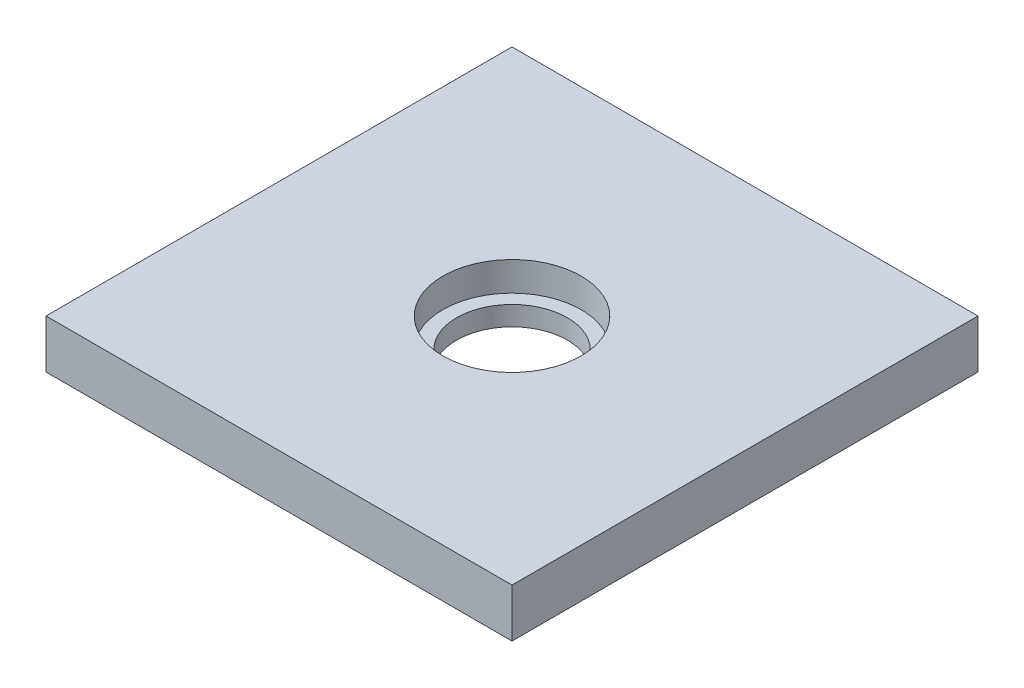
ISO-10303-21;
HEADER;
FILE_DESCRIPTION(('STEP AP214'),'2;1');
FILE_NAME('part.step','',(''),(''),'','','');
FILE_SCHEMA(('AUTOMOTIVE_DESIGN { 1 0 10303 214 1 1 1 1 }'));
ENDSEC;
DATA;
#1=APPLICATION_CONTEXT('core data for automotive mechanical design processes');
#2=APPLICATION_PROTOCOL_DEFINITION('international standard','automotive_design',2000,#1);
#3=PRODUCT_CONTEXT('',#1,'mechanical');
#4=PRODUCT('Part','Part','',(#3));
#5=PRODUCT_RELATED_PRODUCT_CATEGORY('part','',(#4));
#6=PRODUCT_DEFINITION_FORMATION('','',#4);
#7=PRODUCT_DEFINITION_CONTEXT('part definition',#1,'design');
#8=PRODUCT_DEFINITION('design','',#6,#7);
#9=PRODUCT_DEFINITION_SHAPE('','',#8);
#10=(LENGTH_UNIT() NAMED_UNIT(*) SI_UNIT(.MILLI.,.METRE.));
#11=(NAMED_UNIT(*) PLANE_ANGLE_UNIT() SI_UNIT($,.RADIAN.));
#12=(NAMED_UNIT(*) SI_UNIT($,.STERADIAN.) SOLID_ANGLE_UNIT());
#13=UNCERTAINTY_MEASURE_WITH_UNIT(LENGTH_MEASURE(1.E-05),#10,'distance_accuracy_value','');
#14=(GEOMETRIC_REPRESENTATION_CONTEXT(3) GLOBAL_UNCERTAINTY_ASSIGNED_CONTEXT((#13)) GLOBAL_UNIT_ASSIGNED_CONTEXT((#10,
#11,#12)) REPRESENTATION_CONTEXT('',''));
#15=CARTESIAN_POINT('',(0.,0.,0.));
#16=DIRECTION('',(0.,0.,1.));
#17=DIRECTION('',(1.,0.,0.));
#18=AXIS2_PLACEMENT_3D('',#15,#16,#17);
#19=CARTESIAN_POINT('',(-76.2,-7.9375,76.2));
#20=DIRECTION('',(1.,0.,0.));
#21=DIRECTION('',(0.,0.,-1.));
#22=AXIS2_PLACEMENT_3D('',#19,#20,#21);
#23=PLANE('',#22);
#24=DIRECTION('',(0.,-1.,0.));
#25=VECTOR('',#24,1.);
#26=CARTESIAN_POINT('',(-76.2,-7.9375,-76.2));
#27=LINE('',#26,#25);
#28=CARTESIAN_POINT('',(-76.2,7.9375,-76.2));
#29=VERTEX_POINT('',#28);
#30=CARTESIAN_POINT('',(-76.2,-7.9375,-76.2));
#31=VERTEX_POINT('',#30);
#32=EDGE_CURVE('E107',#29,#31,#27,.T.);
#33=ORIENTED_EDGE('',*,*,#32,.T.);
#34=DIRECTION('',(0.,0.,-1.));
#35=VECTOR('',#34,1.);
#36=CARTESIAN_POINT('',(-76.2,-7.9375,76.2));
#37=LINE('',#36,#35);
#38=CARTESIAN_POINT('',(-76.2,-7.9375,76.2));
#39=VERTEX_POINT('',#38);
#40=EDGE_CURVE('E11',#39,#31,#37,.T.);
#41=ORIENTED_EDGE('',*,*,#40,.F.);
#42=DIRECTION('',(0.,-1.,0.));
#43=VECTOR('',#42,1.);
#44=CARTESIAN_POINT('',(-76.2,-7.9375,76.2));
#45=LINE('',#44,#43);
#46=CARTESIAN_POINT('',(-76.2,7.9375,76.2));
#47=VERTEX_POINT('',#46);
#48=EDGE_CURVE('E91',#47,#39,#45,.T.);
#49=ORIENTED_EDGE('',*,*,#48,.F.);
#50=DIRECTION('',(0.,0.,-1.));
#51=VECTOR('',#50,1.);
#52=CARTESIAN_POINT('',(-76.2,7.9375,76.2));
#53=LINE('',#52,#51);
#54=EDGE_CURVE('E103',#47,#29,#53,.T.);
#55=ORIENTED_EDGE('',*,*,#54,.T.);
#56=EDGE_LOOP('',(#33,#41,#49,#55));
#57=FACE_BOUND('',#56,.T.);
#58=ADVANCED_FACE('F39',(#57),#23,.F.);
#59=CARTESIAN_POINT('',(76.2,-7.9375,76.2));
#60=DIRECTION('',(0.,1.,0.));
#61=DIRECTION('',(0.,0.,1.));
#62=AXIS2_PLACEMENT_3D('',#59,#60,#61);
#63=PLANE('',#62);
#64=CARTESIAN_POINT('',(0.,-7.9375,0.));
#65=DIRECTION('',(0.,1.,0.));
#66=DIRECTION('',(0.,0.,1.));
#67=AXIS2_PLACEMENT_3D('',#64,#65,#66);
#68=CIRCLE('',#67,18.0975);
#69=CARTESIAN_POINT('',(0.,-7.9375,18.0975));
#70=VERTEX_POINT('',#69);
#71=EDGE_CURVE('E132',#70,#70,#68,.T.);
#72=ORIENTED_EDGE('',*,*,#71,.T.);
#73=EDGE_LOOP('',(#72));
#74=FACE_BOUND('',#73,.T.);
#75=DIRECTION('',(1.,0.,0.));
#76=VECTOR('',#75,1.);
#77=CARTESIAN_POINT('',(76.2,-7.9375,-76.2));
#78=LINE('',#77,#76);
#79=CARTESIAN_POINT('',(76.2,-7.9375,-76.2));
#80=VERTEX_POINT('',#79);
#81=EDGE_CURVE('E96',#31,#80,#78,.T.);
#82=ORIENTED_EDGE('',*,*,#81,.T.);
#83=DIRECTION('',(0.,0.,-1.));
#84=VECTOR('',#83,1.);
#85=CARTESIAN_POINT('',(76.2,-7.9375,76.2));
#86=LINE('',#85,#84);
#87=CARTESIAN_POINT('',(76.2,-7.9375,76.2));
#88=VERTEX_POINT('',#87);
#89=EDGE_CURVE('E48',#88,#80,#86,.T.);
#90=ORIENTED_EDGE('',*,*,#89,.F.);
#91=DIRECTION('',(1.,0.,0.));
#92=VECTOR('',#91,1.);
#93=CARTESIAN_POINT('',(76.2,-7.9375,76.2));
#94=LINE('',#93,#92);
#95=EDGE_CURVE('E86',#39,#88,#94,.T.);
#96=ORIENTED_EDGE('',*,*,#95,.F.);
#97=ORIENTED_EDGE('',*,*,#40,.T.);
#98=EDGE_LOOP('',(#82,#90,#96,#97));
#99=FACE_BOUND('',#98,.T.);
#100=ADVANCED_FACE('F95',(#74,#99),#63,.F.);
#101=CARTESIAN_POINT('',(76.2,7.9375,76.2));
#102=DIRECTION('',(-1.,0.,0.));
#103=DIRECTION('',(0.,0.,1.));
#104=AXIS2_PLACEMENT_3D('',#101,#102,#103);
#105=PLANE('',#104);
#106=DIRECTION('',(0.,1.,0.));
#107=VECTOR('',#106,1.);
#108=CARTESIAN_POINT('',(76.2,7.9375,-76.2));
#109=LINE('',#108,#107);
#110=CARTESIAN_POINT('',(76.2,7.9375,-76.2));
#111=VERTEX_POINT('',#110);
#112=EDGE_CURVE('E73',#80,#111,#109,.T.);
#113=ORIENTED_EDGE('',*,*,#112,.T.);
#114=DIRECTION('',(0.,0.,-1.));
#115=VECTOR('',#114,1.);
#116=CARTESIAN_POINT('',(76.2,7.9375,76.2));
#117=LINE('',#116,#115);
#118=CARTESIAN_POINT('',(76.2,7.9375,76.2));
#119=VERTEX_POINT('',#118);
#120=EDGE_CURVE('E98',#119,#111,#117,.T.);
#121=ORIENTED_EDGE('',*,*,#120,.F.);
#122=DIRECTION('',(0.,1.,0.));
#123=VECTOR('',#122,1.);
#124=CARTESIAN_POINT('',(76.2,7.9375,76.2));
#125=LINE('',#124,#123);
#126=EDGE_CURVE('E89',#88,#119,#125,.T.);
#127=ORIENTED_EDGE('',*,*,#126,.F.);
#128=ORIENTED_EDGE('',*,*,#89,.T.);
#129=EDGE_LOOP('',(#113,#121,#127,#128));
#130=FACE_BOUND('',#129,.T.);
#131=ADVANCED_FACE('F99',(#130),#105,.F.);
#132=CARTESIAN_POINT('',(-76.2,7.9375,76.2));
#133=DIRECTION('',(0.,-1.,0.));
#134=DIRECTION('',(0.,0.,-1.));
#135=AXIS2_PLACEMENT_3D('',#132,#133,#134);
#136=PLANE('',#135);
#137=CARTESIAN_POINT('',(0.,7.9375,0.));
#138=DIRECTION('',(0.,1.,0.));
#139=DIRECTION('',(0.,0.,1.));
#140=AXIS2_PLACEMENT_3D('',#137,#138,#139);
#141=CIRCLE('',#140,22.621875);
#142=CARTESIAN_POINT('',(0.,7.9375,22.621875));
#143=VERTEX_POINT('',#142);
#144=EDGE_CURVE('E128',#143,#143,#141,.T.);
#145=ORIENTED_EDGE('',*,*,#144,.F.);
#146=EDGE_LOOP('',(#145));
#147=FACE_BOUND('',#146,.T.);
#148=DIRECTION('',(-1.,0.,0.));
#149=VECTOR('',#148,1.);
#150=CARTESIAN_POINT('',(-76.2,7.9375,-76.2));
#151=LINE('',#150,#149);
#152=EDGE_CURVE('E79',#111,#29,#151,.T.);
#153=ORIENTED_EDGE('',*,*,#152,.T.);
#154=ORIENTED_EDGE('',*,*,#54,.F.);
#155=DIRECTION('',(-1.,0.,0.));
#156=VECTOR('',#155,1.);
#157=CARTESIAN_POINT('',(-76.2,7.9375,76.2));
#158=LINE('',#157,#156);
#159=EDGE_CURVE('E56',#119,#47,#158,.T.);
#160=ORIENTED_EDGE('',*,*,#159,.F.);
#161=ORIENTED_EDGE('',*,*,#120,.T.);
#162=EDGE_LOOP('',(#153,#154,#160,#161));
#163=FACE_BOUND('',#162,.T.);
#164=ADVANCED_FACE('F121',(#147,#163),#136,.F.);
#165=CARTESIAN_POINT('',(0.,0.,76.2));
#166=DIRECTION('',(0.,0.,-1.));
#167=DIRECTION('',(-1.,0.,0.));
#168=AXIS2_PLACEMENT_3D('',#165,#166,#167);
#169=PLANE('',#168);
#170=ORIENTED_EDGE('',*,*,#48,.T.);
#171=ORIENTED_EDGE('',*,*,#95,.T.);
#172=ORIENTED_EDGE('',*,*,#126,.T.);
#173=ORIENTED_EDGE('',*,*,#159,.T.);
#174=EDGE_LOOP('',(#170,#171,#172,#173));
#175=FACE_BOUND('',#174,.T.);
#176=ADVANCED_FACE('F87',(#175),#169,.F.);
#177=CARTESIAN_POINT('',(0.,0.,-76.2));
#178=DIRECTION('',(0.,0.,-1.));
#179=DIRECTION('',(-1.,0.,0.));
#180=AXIS2_PLACEMENT_3D('',#177,#178,#179);
#181=PLANE('',#180);
#182=ORIENTED_EDGE('',*,*,#32,.F.);
#183=ORIENTED_EDGE('',*,*,#152,.F.);
#184=ORIENTED_EDGE('',*,*,#112,.F.);
#185=ORIENTED_EDGE('',*,*,#81,.F.);
#186=EDGE_LOOP('',(#182,#183,#184,#185));
#187=FACE_BOUND('',#186,.T.);
#188=ADVANCED_FACE('F124',(#187),#181,.T.);
#189=CARTESIAN_POINT('',(0.,-1.5875,0.));
#190=DIRECTION('',(0.,1.,0.));
#191=DIRECTION('',(0.,0.,1.));
#192=AXIS2_PLACEMENT_3D('',#189,#190,#191);
#193=CYLINDRICAL_SURFACE('',#192,22.621875);
#194=CARTESIAN_POINT('',(0.,-1.5875,0.));
#195=DIRECTION('',(0.,1.,0.));
#196=DIRECTION('',(0.,0.,1.));
#197=AXIS2_PLACEMENT_3D('',#194,#195,#196);
#198=CIRCLE('',#197,22.621875);
#199=CARTESIAN_POINT('',(0.,-1.5875,22.621875));
#200=VERTEX_POINT('',#199);
#201=EDGE_CURVE('E111',#200,#200,#198,.T.);
#202=CARTESIAN_POINT('',(0.,-1.5875,22.621875));
#203=CARTESIAN_POINT('',(0.,-1.48828125,22.621875));
#204=CARTESIAN_POINT('',(0.,-1.3890625,22.621875));
#205=CARTESIAN_POINT('',(0.,-1.190625,22.621875));
#206=CARTESIAN_POINT('',(0.,-1.09140625,22.621875));
#207=CARTESIAN_POINT('',(0.,-0.892968749999999,22.621875));
#208=CARTESIAN_POINT('',(0.,-0.793749999999999,22.621875));
#209=CARTESIAN_POINT('',(0.,-0.595312499999999,22.621875));
#210=CARTESIAN_POINT('',(0.,-0.496093749999999,22.621875));
#211=CARTESIAN_POINT('',(0.,-0.297656249999999,22.621875));
#212=CARTESIAN_POINT('',(0.,-0.198437499999998,22.621875));
#213=CARTESIAN_POINT('',(0.,0.,22.621875));
#214=CARTESIAN_POINT('',(0.,0.0992187500000016,22.621875));
#215=CARTESIAN_POINT('',(0.,0.297656250000001,22.621875));
#216=CARTESIAN_POINT('',(0.,0.396875000000001,22.621875));
#217=CARTESIAN_POINT('',(0.,0.595312500000001,22.621875));
#218=CARTESIAN_POINT('',(0.,0.694531250000001,22.621875));
#219=CARTESIAN_POINT('',(0.,0.892968750000002,22.621875));
#220=CARTESIAN_POINT('',(0.,0.992187500000002,22.621875));
#221=CARTESIAN_POINT('',(0.,1.190625,22.621875));
#222=CARTESIAN_POINT('',(0.,1.28984375,22.621875));
#223=CARTESIAN_POINT('',(0.,1.48828125,22.621875));
#224=CARTESIAN_POINT('',(0.,1.5875,22.621875));
#225=CARTESIAN_POINT('',(0.,1.7859375,22.621875));
#226=CARTESIAN_POINT('',(0.,1.88515625,22.621875));
#227=CARTESIAN_POINT('',(0.,2.08359375,22.621875));
#228=CARTESIAN_POINT('',(0.,2.1828125,22.621875));
#229=CARTESIAN_POINT('',(0.,2.38125,22.621875));
#230=CARTESIAN_POINT('',(0.,2.48046875,22.621875));
#231=CARTESIAN_POINT('',(0.,2.67890625,22.621875));
#232=CARTESIAN_POINT('',(0.,2.778125,22.621875));
#233=CARTESIAN_POINT('',(0.,2.9765625,22.621875));
#234=CARTESIAN_POINT('',(0.,3.07578125,22.621875));
#235=CARTESIAN_POINT('',(0.,3.27421875,22.621875));
#236=CARTESIAN_POINT('',(0.,3.3734375,22.621875));
#237=CARTESIAN_POINT('',(0.,3.571875,22.621875));
#238=CARTESIAN_POINT('',(0.,3.67109375,22.621875));
#239=CARTESIAN_POINT('',(0.,3.86953125,22.621875));
#240=CARTESIAN_POINT('',(0.,3.96875,22.621875));
#241=CARTESIAN_POINT('',(0.,4.1671875,22.621875));
#242=CARTESIAN_POINT('',(0.,4.26640625,22.621875));
#243=CARTESIAN_POINT('',(0.,4.46484375,22.621875));
#244=CARTESIAN_POINT('',(0.,4.5640625,22.621875));
#245=CARTESIAN_POINT('',(0.,4.7625,22.621875));
#246=CARTESIAN_POINT('',(0.,4.86171875,22.621875));
#247=CARTESIAN_POINT('',(0.,5.06015625,22.621875));
#248=CARTESIAN_POINT('',(0.,5.159375,22.621875));
#249=CARTESIAN_POINT('',(0.,5.3578125,22.621875));
#250=CARTESIAN_POINT('',(0.,5.45703125,22.621875));
#251=CARTESIAN_POINT('',(0.,5.65546875,22.621875));
#252=CARTESIAN_POINT('',(0.,5.7546875,22.621875));
#253=CARTESIAN_POINT('',(0.,5.953125,22.621875));
#254=CARTESIAN_POINT('',(0.,6.05234375,22.621875));
#255=CARTESIAN_POINT('',(0.,6.25078125,22.621875));
#256=CARTESIAN_POINT('',(0.,6.35,22.621875));
#257=CARTESIAN_POINT('',(0.,6.5484375,22.621875));
#258=CARTESIAN_POINT('',(0.,6.64765625,22.621875));
#259=CARTESIAN_POINT('',(0.,6.84609375,22.621875));
#260=CARTESIAN_POINT('',(0.,6.9453125,22.621875));
#261=CARTESIAN_POINT('',(0.,7.14375,22.621875));
#262=CARTESIAN_POINT('',(0.,7.24296875,22.621875));
#263=CARTESIAN_POINT('',(0.,7.44140625,22.621875));
#264=CARTESIAN_POINT('',(0.,7.540625,22.621875));
#265=CARTESIAN_POINT('',(0.,7.7390625,22.621875));
#266=CARTESIAN_POINT('',(0.,7.83828125,22.621875));
#267=CARTESIAN_POINT('',(0.,7.9375,22.621875));
#268=B_SPLINE_CURVE_WITH_KNOTS('',3,(#202,#203,#204,#205,#206,#207,#208,#209,#210,#211,#212,
#213,#214,#215,#216,#217,#218,#219,#220,#221,#222,#223,#224,#225,#226,#227,#228,#229,#230,#231,
#232,#233,#234,#235,#236,#237,#238,#239,#240,#241,#242,#243,#244,#245,#246,#247,#248,#249,#250,
#251,#252,#253,#254,#255,#256,#257,#258,#259,#260,#261,#262,#263,#264,#265,#266,#267),
.UNSPECIFIED.,.F.,.F.,(4,2,2,2,2,2,2,2,2,2,2,2,2,2,2,2,2,2,2,2,2,2,2,2,2,2,2,2,2,2,2,2,4),(0.,
0.29765625,0.5953125,0.89296875,1.190625,1.48828125,1.7859375,2.08359375,2.38125,2.67890625,
2.9765625,3.27421875,3.571875,3.86953125,4.1671875,4.46484375,4.7625,5.06015625,5.3578125,
5.65546875,5.953125,6.25078125,6.5484375,6.84609375,7.14375,7.44140625,7.7390625,8.03671875,
8.334375,8.63203125,8.9296875,9.22734375,9.525),.UNSPECIFIED.);
#269=EDGE_CURVE('BSEAM154',#200,#143,#268,.T.);
#270=ORIENTED_EDGE('',*,*,#201,.F.);
#271=ORIENTED_EDGE('',*,*,#144,.T.);
#272=ORIENTED_EDGE('',*,*,#269,.T.);
#273=ORIENTED_EDGE('',*,*,#269,.F.);
#274=EDGE_LOOP('',(#270,#272,#271,#273));
#275=FACE_BOUND('',#274,.T.);
#276=ADVANCED_FACE('F154',(#275),#193,.F.);
#277=CARTESIAN_POINT('',(0.,-1.5875,0.));
#278=DIRECTION('',(0.,1.,0.));
#279=DIRECTION('',(0.,0.,1.));
#280=AXIS2_PLACEMENT_3D('',#277,#278,#279);
#281=PLANE('',#280);
#282=CARTESIAN_POINT('',(0.,-1.5875,0.));
#283=DIRECTION('',(0.,1.,0.));
#284=DIRECTION('',(0.,0.,1.));
#285=AXIS2_PLACEMENT_3D('',#282,#283,#284);
#286=CIRCLE('',#285,18.0975);
#287=CARTESIAN_POINT('',(0.,-1.5875,18.0975));
#288=VERTEX_POINT('',#287);
#289=EDGE_CURVE('E136',#288,#288,#286,.T.);
#290=ORIENTED_EDGE('',*,*,#289,.F.);
#291=EDGE_LOOP('',(#290));
#292=FACE_BOUND('',#291,.T.);
#293=ORIENTED_EDGE('',*,*,#201,.T.);
#294=EDGE_LOOP('',(#293));
#295=FACE_BOUND('',#294,.T.);
#296=ADVANCED_FACE('F148',(#292,#295),#281,.T.);
#297=CARTESIAN_POINT('',(0.,-7.9375,0.));
#298=DIRECTION('',(0.,1.,0.));
#299=DIRECTION('',(0.,0.,1.));
#300=AXIS2_PLACEMENT_3D('',#297,#298,#299);
#301=CYLINDRICAL_SURFACE('',#300,18.0975);
#302=ORIENTED_EDGE('',*,*,#71,.F.);
#303=EDGE_LOOP('',(#302));
#304=FACE_BOUND('',#303,.T.);
#305=ORIENTED_EDGE('',*,*,#289,.T.);
#306=EDGE_LOOP('',(#305));
#307=FACE_BOUND('',#306,.T.);
#308=ADVANCED_FACE('F145',(#304,#307),#301,.F.);
#309=CLOSED_SHELL('',(#58,#100,#131,#164,#176,#188,#276,#296,#308));
#310=MANIFOLD_SOLID_BREP('B2',#309);
#311=ADVANCED_BREP_SHAPE_REPRESENTATION('',(#18,#310),#14);
#312=SHAPE_DEFINITION_REPRESENTATION(#9,#311);
ENDSEC;
END-ISO-10303-21;
